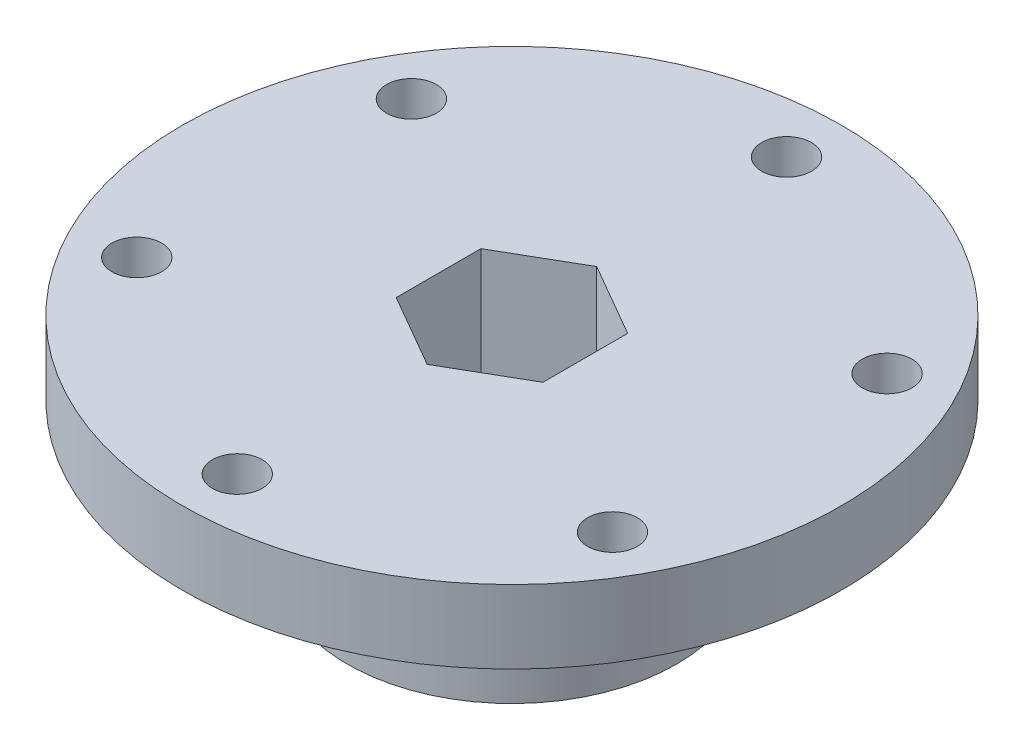
ISO-10303-21;
HEADER;
FILE_DESCRIPTION(('STEP AP214'),'2;1');
FILE_NAME('part.step','',(''),(''),'','','');
FILE_SCHEMA(('AUTOMOTIVE_DESIGN { 1 0 10303 214 1 1 1 1 }'));
ENDSEC;
DATA;
#1=APPLICATION_CONTEXT('core data for automotive mechanical design processes');
#2=APPLICATION_PROTOCOL_DEFINITION('international standard','automotive_design',2000,#1);
#3=PRODUCT_CONTEXT('',#1,'mechanical');
#4=PRODUCT('Part','Part','',(#3));
#5=PRODUCT_RELATED_PRODUCT_CATEGORY('part','',(#4));
#6=PRODUCT_DEFINITION_FORMATION('','',#4);
#7=PRODUCT_DEFINITION_CONTEXT('part definition',#1,'design');
#8=PRODUCT_DEFINITION('design','',#6,#7);
#9=PRODUCT_DEFINITION_SHAPE('','',#8);
#10=(LENGTH_UNIT() NAMED_UNIT(*) SI_UNIT(.MILLI.,.METRE.));
#11=(NAMED_UNIT(*) PLANE_ANGLE_UNIT() SI_UNIT($,.RADIAN.));
#12=(NAMED_UNIT(*) SI_UNIT($,.STERADIAN.) SOLID_ANGLE_UNIT());
#13=UNCERTAINTY_MEASURE_WITH_UNIT(LENGTH_MEASURE(1.E-05),#10,'distance_accuracy_value','');
#14=(GEOMETRIC_REPRESENTATION_CONTEXT(3) GLOBAL_UNCERTAINTY_ASSIGNED_CONTEXT((#13)) GLOBAL_UNIT_ASSIGNED_CONTEXT((#10,
#11,#12)) REPRESENTATION_CONTEXT('',''));
#15=CARTESIAN_POINT('',(0.,0.,0.));
#16=DIRECTION('',(0.,0.,1.));
#17=DIRECTION('',(1.,0.,0.));
#18=AXIS2_PLACEMENT_3D('',#15,#16,#17);
#19=CARTESIAN_POINT('',(20.6222299276169,-19.05,11.90625));
#20=DIRECTION('',(0.,1.,0.));
#21=DIRECTION('',(1.,0.,0.));
#22=AXIS2_PLACEMENT_3D('',#19,#20,#21);
#23=CYLINDRICAL_SURFACE('',#22,2.159);
#24=CARTESIAN_POINT('',(20.6222299276169,0.,11.90625));
#25=DIRECTION('',(0.,-1.,0.));
#26=DIRECTION('',(1.,0.,0.));
#27=AXIS2_PLACEMENT_3D('',#24,#25,#26);
#28=CIRCLE('',#27,2.159);
#29=CARTESIAN_POINT('',(22.7812299276169,0.,11.90625));
#30=VERTEX_POINT('',#29);
#31=EDGE_CURVE('E222',#30,#30,#28,.T.);
#32=ORIENTED_EDGE('',*,*,#31,.F.);
#33=EDGE_LOOP('',(#32));
#34=FACE_BOUND('',#33,.T.);
#35=CARTESIAN_POINT('',(20.6222299276169,-6.35,11.90625));
#36=DIRECTION('',(0.,1.,0.));
#37=DIRECTION('',(1.,0.,0.));
#38=AXIS2_PLACEMENT_3D('',#35,#36,#37);
#39=CIRCLE('',#38,2.159);
#40=CARTESIAN_POINT('',(22.7812299276169,-6.35,11.90625));
#41=VERTEX_POINT('',#40);
#42=EDGE_CURVE('E177',#41,#41,#39,.T.);
#43=ORIENTED_EDGE('',*,*,#42,.F.);
#44=EDGE_LOOP('',(#43));
#45=FACE_BOUND('',#44,.T.);
#46=ADVANCED_FACE('F17',(#34,#45),#23,.F.);
#47=CARTESIAN_POINT('',(0.,-19.05,23.8125));
#48=DIRECTION('',(0.,1.,0.));
#49=DIRECTION('',(1.,0.,0.));
#50=AXIS2_PLACEMENT_3D('',#47,#48,#49);
#51=CYLINDRICAL_SURFACE('',#50,2.159);
#52=CARTESIAN_POINT('',(0.,0.,23.8125));
#53=DIRECTION('',(0.,-1.,0.));
#54=DIRECTION('',(1.,0.,0.));
#55=AXIS2_PLACEMENT_3D('',#52,#53,#54);
#56=CIRCLE('',#55,2.159);
#57=CARTESIAN_POINT('',(2.159,0.,23.8125));
#58=VERTEX_POINT('',#57);
#59=EDGE_CURVE('E219',#58,#58,#56,.T.);
#60=ORIENTED_EDGE('',*,*,#59,.F.);
#61=EDGE_LOOP('',(#60));
#62=FACE_BOUND('',#61,.T.);
#63=CARTESIAN_POINT('',(0.,-6.35,23.8125));
#64=DIRECTION('',(0.,1.,0.));
#65=DIRECTION('',(1.,0.,0.));
#66=AXIS2_PLACEMENT_3D('',#63,#64,#65);
#67=CIRCLE('',#66,2.159);
#68=CARTESIAN_POINT('',(2.159,-6.35,23.8125));
#69=VERTEX_POINT('',#68);
#70=EDGE_CURVE('E174',#69,#69,#67,.T.);
#71=ORIENTED_EDGE('',*,*,#70,.F.);
#72=EDGE_LOOP('',(#71));
#73=FACE_BOUND('',#72,.T.);
#74=ADVANCED_FACE('F347',(#62,#73),#51,.F.);
#75=CARTESIAN_POINT('',(-20.6222299276169,-19.05,-11.90625));
#76=DIRECTION('',(0.,1.,0.));
#77=DIRECTION('',(1.,0.,0.));
#78=AXIS2_PLACEMENT_3D('',#75,#76,#77);
#79=CYLINDRICAL_SURFACE('',#78,2.159);
#80=CARTESIAN_POINT('',(-20.6222299276169,0.,-11.90625));
#81=DIRECTION('',(0.,-1.,0.));
#82=DIRECTION('',(1.,0.,0.));
#83=AXIS2_PLACEMENT_3D('',#80,#81,#82);
#84=CIRCLE('',#83,2.159);
#85=CARTESIAN_POINT('',(-18.4632299276169,0.,-11.90625));
#86=VERTEX_POINT('',#85);
#87=EDGE_CURVE('E216',#86,#86,#84,.T.);
#88=ORIENTED_EDGE('',*,*,#87,.F.);
#89=EDGE_LOOP('',(#88));
#90=FACE_BOUND('',#89,.T.);
#91=CARTESIAN_POINT('',(-20.6222299276169,-6.35,-11.90625));
#92=DIRECTION('',(0.,1.,0.));
#93=DIRECTION('',(1.,0.,0.));
#94=AXIS2_PLACEMENT_3D('',#91,#92,#93);
#95=CIRCLE('',#94,2.159);
#96=CARTESIAN_POINT('',(-18.4632299276169,-6.35,-11.90625));
#97=VERTEX_POINT('',#96);
#98=EDGE_CURVE('E162',#97,#97,#95,.T.);
#99=ORIENTED_EDGE('',*,*,#98,.F.);
#100=EDGE_LOOP('',(#99));
#101=FACE_BOUND('',#100,.T.);
#102=ADVANCED_FACE('F352',(#90,#101),#79,.F.);
#103=CARTESIAN_POINT('',(0.,-19.05,-23.8125));
#104=DIRECTION('',(0.,1.,0.));
#105=DIRECTION('',(1.,0.,0.));
#106=AXIS2_PLACEMENT_3D('',#103,#104,#105);
#107=CYLINDRICAL_SURFACE('',#106,2.159);
#108=CARTESIAN_POINT('',(0.,0.,-23.8125));
#109=DIRECTION('',(0.,-1.,0.));
#110=DIRECTION('',(1.,0.,0.));
#111=AXIS2_PLACEMENT_3D('',#108,#109,#110);
#112=CIRCLE('',#111,2.159);
#113=CARTESIAN_POINT('',(2.159,0.,-23.8125));
#114=VERTEX_POINT('',#113);
#115=EDGE_CURVE('E181',#114,#114,#112,.T.);
#116=ORIENTED_EDGE('',*,*,#115,.F.);
#117=EDGE_LOOP('',(#116));
#118=FACE_BOUND('',#117,.T.);
#119=CARTESIAN_POINT('',(0.,-6.35,-23.8125));
#120=DIRECTION('',(0.,1.,0.));
#121=DIRECTION('',(1.,0.,0.));
#122=AXIS2_PLACEMENT_3D('',#119,#120,#121);
#123=CIRCLE('',#122,2.159);
#124=CARTESIAN_POINT('',(2.159,-6.35,-23.8125));
#125=VERTEX_POINT('',#124);
#126=EDGE_CURVE('E156',#125,#125,#123,.T.);
#127=ORIENTED_EDGE('',*,*,#126,.F.);
#128=EDGE_LOOP('',(#127));
#129=FACE_BOUND('',#128,.T.);
#130=ADVANCED_FACE('F387',(#118,#129),#107,.F.);
#131=CARTESIAN_POINT('',(-20.6222299276169,-19.05,11.90625));
#132=DIRECTION('',(0.,1.,0.));
#133=DIRECTION('',(1.,0.,0.));
#134=AXIS2_PLACEMENT_3D('',#131,#132,#133);
#135=CYLINDRICAL_SURFACE('',#134,2.159);
#136=CARTESIAN_POINT('',(-20.6222299276169,0.,11.90625));
#137=DIRECTION('',(0.,-1.,0.));
#138=DIRECTION('',(1.,0.,0.));
#139=AXIS2_PLACEMENT_3D('',#136,#137,#138);
#140=CIRCLE('',#139,2.159);
#141=CARTESIAN_POINT('',(-18.4632299276169,0.,11.90625));
#142=VERTEX_POINT('',#141);
#143=EDGE_CURVE('E178',#142,#142,#140,.T.);
#144=ORIENTED_EDGE('',*,*,#143,.F.);
#145=EDGE_LOOP('',(#144));
#146=FACE_BOUND('',#145,.T.);
#147=CARTESIAN_POINT('',(-20.6222299276169,-6.35,11.90625));
#148=DIRECTION('',(0.,1.,0.));
#149=DIRECTION('',(1.,0.,0.));
#150=AXIS2_PLACEMENT_3D('',#147,#148,#149);
#151=CIRCLE('',#150,2.159);
#152=CARTESIAN_POINT('',(-18.4632299276169,-6.35,11.90625));
#153=VERTEX_POINT('',#152);
#154=EDGE_CURVE('E151',#153,#153,#151,.T.);
#155=ORIENTED_EDGE('',*,*,#154,.F.);
#156=EDGE_LOOP('',(#155));
#157=FACE_BOUND('',#156,.T.);
#158=ADVANCED_FACE('F364',(#146,#157),#135,.F.);
#159=CARTESIAN_POINT('',(20.6222299276169,-19.05,-11.90625));
#160=DIRECTION('',(0.,1.,0.));
#161=DIRECTION('',(1.,0.,0.));
#162=AXIS2_PLACEMENT_3D('',#159,#160,#161);
#163=CYLINDRICAL_SURFACE('',#162,2.159);
#164=CARTESIAN_POINT('',(20.6222299276169,0.,-11.90625));
#165=DIRECTION('',(0.,-1.,0.));
#166=DIRECTION('',(1.,0.,0.));
#167=AXIS2_PLACEMENT_3D('',#164,#165,#166);
#168=CIRCLE('',#167,2.159);
#169=CARTESIAN_POINT('',(22.7812299276169,0.,-11.90625));
#170=VERTEX_POINT('',#169);
#171=EDGE_CURVE('E182',#170,#170,#168,.T.);
#172=ORIENTED_EDGE('',*,*,#171,.F.);
#173=EDGE_LOOP('',(#172));
#174=FACE_BOUND('',#173,.T.);
#175=CARTESIAN_POINT('',(20.6222299276169,-6.35,-11.90625));
#176=DIRECTION('',(0.,1.,0.));
#177=DIRECTION('',(1.,0.,0.));
#178=AXIS2_PLACEMENT_3D('',#175,#176,#177);
#179=CIRCLE('',#178,2.159);
#180=CARTESIAN_POINT('',(22.7812299276169,-6.35,-11.90625));
#181=VERTEX_POINT('',#180);
#182=EDGE_CURVE('E157',#181,#181,#179,.T.);
#183=ORIENTED_EDGE('',*,*,#182,.F.);
#184=EDGE_LOOP('',(#183));
#185=FACE_BOUND('',#184,.T.);
#186=ADVANCED_FACE('F359',(#174,#185),#163,.F.);
#187=CARTESIAN_POINT('',(-6.3627,-19.05,3.67350655777282));
#188=DIRECTION('',(-0.5,0.,0.866025403784439));
#189=DIRECTION('',(0.,1.,0.));
#190=AXIS2_PLACEMENT_3D('',#187,#188,#189);
#191=PLANE('',#190);
#192=DIRECTION('',(-0.866025403784439,0.,-0.5));
#193=VECTOR('',#192,1.);
#194=CARTESIAN_POINT('',(-4.772025,0.,4.59188319721603));
#195=LINE('',#194,#193);
#196=CARTESIAN_POINT('',(0.,0.,7.34701311554565));
#197=VERTEX_POINT('',#196);
#198=CARTESIAN_POINT('',(-6.3627,0.,3.67350655777282));
#199=VERTEX_POINT('',#198);
#200=EDGE_CURVE('E193',#197,#199,#195,.T.);
#201=ORIENTED_EDGE('',*,*,#200,.F.);
#202=DIRECTION('',(0.,1.,0.));
#203=VECTOR('',#202,1.);
#204=CARTESIAN_POINT('',(0.,-19.05,7.34701311554565));
#205=LINE('',#204,#203);
#206=CARTESIAN_POINT('',(0.,-19.05,7.34701311554565));
#207=VERTEX_POINT('',#206);
#208=EDGE_CURVE('E256',#207,#197,#205,.T.);
#209=ORIENTED_EDGE('',*,*,#208,.F.);
#210=DIRECTION('',(0.866025403784439,0.,0.5));
#211=VECTOR('',#210,1.);
#212=CARTESIAN_POINT('',(-4.772025,-19.05,4.59188319721603));
#213=LINE('',#212,#211);
#214=CARTESIAN_POINT('',(-6.3627,-19.05,3.67350655777282));
#215=VERTEX_POINT('',#214);
#216=EDGE_CURVE('E240',#215,#207,#213,.T.);
#217=ORIENTED_EDGE('',*,*,#216,.F.);
#218=DIRECTION('',(0.,1.,0.));
#219=VECTOR('',#218,1.);
#220=CARTESIAN_POINT('',(-6.3627,-19.05,3.67350655777282));
#221=LINE('',#220,#219);
#222=EDGE_CURVE('E11',#215,#199,#221,.T.);
#223=ORIENTED_EDGE('',*,*,#222,.T.);
#224=EDGE_LOOP('',(#201,#209,#217,#223));
#225=FACE_BOUND('',#224,.T.);
#226=ADVANCED_FACE('F282',(#225),#191,.F.);
#227=CARTESIAN_POINT('',(-6.3627,-19.05,-3.67350655777282));
#228=DIRECTION('',(-1.,0.,0.));
#229=DIRECTION('',(0.,0.,1.));
#230=AXIS2_PLACEMENT_3D('',#227,#228,#229);
#231=PLANE('',#230);
#232=DIRECTION('',(0.,0.,-1.));
#233=VECTOR('',#232,1.);
#234=CARTESIAN_POINT('',(-6.3627,0.,-1.83675327888642));
#235=LINE('',#234,#233);
#236=CARTESIAN_POINT('',(-6.3627,0.,-3.67350655777282));
#237=VERTEX_POINT('',#236);
#238=EDGE_CURVE('E198',#199,#237,#235,.T.);
#239=ORIENTED_EDGE('',*,*,#238,.F.);
#240=ORIENTED_EDGE('',*,*,#222,.F.);
#241=DIRECTION('',(0.,0.,1.));
#242=VECTOR('',#241,1.);
#243=CARTESIAN_POINT('',(-6.3627,-19.05,-1.83675327888642));
#244=LINE('',#243,#242);
#245=CARTESIAN_POINT('',(-6.3627,-19.05,-3.67350655777282));
#246=VERTEX_POINT('',#245);
#247=EDGE_CURVE('E236',#246,#215,#244,.T.);
#248=ORIENTED_EDGE('',*,*,#247,.F.);
#249=DIRECTION('',(0.,1.,0.));
#250=VECTOR('',#249,1.);
#251=CARTESIAN_POINT('',(-6.3627,-19.05,-3.67350655777282));
#252=LINE('',#251,#250);
#253=EDGE_CURVE('E20',#246,#237,#252,.T.);
#254=ORIENTED_EDGE('',*,*,#253,.T.);
#255=EDGE_LOOP('',(#239,#240,#248,#254));
#256=FACE_BOUND('',#255,.T.);
#257=ADVANCED_FACE('F284',(#256),#231,.F.);
#258=CARTESIAN_POINT('',(0.,-19.05,-7.34701311554568));
#259=DIRECTION('',(-0.5,0.,-0.866025403784439));
#260=DIRECTION('',(-0.866025403784439,0.,0.5));
#261=AXIS2_PLACEMENT_3D('',#258,#259,#260);
#262=PLANE('',#261);
#263=DIRECTION('',(0.866025403784439,0.,-0.5));
#264=VECTOR('',#263,1.);
#265=CARTESIAN_POINT('',(-1.590675,0.,-6.42863647610245));
#266=LINE('',#265,#264);
#267=CARTESIAN_POINT('',(0.,0.,-7.34701311554568));
#268=VERTEX_POINT('',#267);
#269=EDGE_CURVE('E202',#237,#268,#266,.T.);
#270=ORIENTED_EDGE('',*,*,#269,.F.);
#271=ORIENTED_EDGE('',*,*,#253,.F.);
#272=DIRECTION('',(-0.866025403784439,0.,0.5));
#273=VECTOR('',#272,1.);
#274=CARTESIAN_POINT('',(-1.590675,-19.05,-6.42863647610245));
#275=LINE('',#274,#273);
#276=CARTESIAN_POINT('',(0.,-19.05,-7.34701311554568));
#277=VERTEX_POINT('',#276);
#278=EDGE_CURVE('E232',#277,#246,#275,.T.);
#279=ORIENTED_EDGE('',*,*,#278,.F.);
#280=DIRECTION('',(0.,1.,0.));
#281=VECTOR('',#280,1.);
#282=CARTESIAN_POINT('',(0.,-19.05,-7.34701311554568));
#283=LINE('',#282,#281);
#284=EDGE_CURVE('E169',#277,#268,#283,.T.);
#285=ORIENTED_EDGE('',*,*,#284,.T.);
#286=EDGE_LOOP('',(#270,#271,#279,#285));
#287=FACE_BOUND('',#286,.T.);
#288=ADVANCED_FACE('F273',(#287),#262,.F.);
#289=CARTESIAN_POINT('',(6.3627,-19.05,-3.67350655777282));
#290=DIRECTION('',(0.5,0.,-0.866025403784439));
#291=DIRECTION('',(0.,-1.,0.));
#292=AXIS2_PLACEMENT_3D('',#289,#290,#291);
#293=PLANE('',#292);
#294=DIRECTION('',(0.866025403784439,0.,0.5));
#295=VECTOR('',#294,1.);
#296=CARTESIAN_POINT('',(4.772025,0.,-4.59188319721605));
#297=LINE('',#296,#295);
#298=CARTESIAN_POINT('',(6.3627,0.,-3.67350655777282));
#299=VERTEX_POINT('',#298);
#300=EDGE_CURVE('E188',#268,#299,#297,.T.);
#301=ORIENTED_EDGE('',*,*,#300,.F.);
#302=ORIENTED_EDGE('',*,*,#284,.F.);
#303=DIRECTION('',(-0.866025403784439,0.,-0.5));
#304=VECTOR('',#303,1.);
#305=CARTESIAN_POINT('',(4.772025,-19.05,-4.59188319721603));
#306=LINE('',#305,#304);
#307=CARTESIAN_POINT('',(6.3627,-19.05,-3.67350655777282));
#308=VERTEX_POINT('',#307);
#309=EDGE_CURVE('E228',#308,#277,#306,.T.);
#310=ORIENTED_EDGE('',*,*,#309,.F.);
#311=DIRECTION('',(0.,1.,0.));
#312=VECTOR('',#311,1.);
#313=CARTESIAN_POINT('',(6.3627,-19.05,-3.67350655777282));
#314=LINE('',#313,#312);
#315=EDGE_CURVE('E170',#308,#299,#314,.T.);
#316=ORIENTED_EDGE('',*,*,#315,.T.);
#317=EDGE_LOOP('',(#301,#302,#310,#316));
#318=FACE_BOUND('',#317,.T.);
#319=ADVANCED_FACE('F265',(#318),#293,.F.);
#320=CARTESIAN_POINT('',(6.3627,-19.05,3.67350655777282));
#321=DIRECTION('',(1.,0.,0.));
#322=DIRECTION('',(0.,0.,1.));
#323=AXIS2_PLACEMENT_3D('',#320,#321,#322);
#324=PLANE('',#323);
#325=DIRECTION('',(0.,0.,1.));
#326=VECTOR('',#325,1.);
#327=CARTESIAN_POINT('',(6.3627,0.,1.83675327888642));
#328=LINE('',#327,#326);
#329=CARTESIAN_POINT('',(6.3627,0.,3.67350655777282));
#330=VERTEX_POINT('',#329);
#331=EDGE_CURVE('E194',#299,#330,#328,.T.);
#332=ORIENTED_EDGE('',*,*,#331,.F.);
#333=ORIENTED_EDGE('',*,*,#315,.F.);
#334=DIRECTION('',(0.,0.,-1.));
#335=VECTOR('',#334,1.);
#336=CARTESIAN_POINT('',(6.3627,-19.05,1.83675327888642));
#337=LINE('',#336,#335);
#338=CARTESIAN_POINT('',(6.3627,-19.05,3.67350655777282));
#339=VERTEX_POINT('',#338);
#340=EDGE_CURVE('E248',#339,#308,#337,.T.);
#341=ORIENTED_EDGE('',*,*,#340,.F.);
#342=DIRECTION('',(0.,1.,0.));
#343=VECTOR('',#342,1.);
#344=CARTESIAN_POINT('',(6.3627,-19.05,3.67350655777282));
#345=LINE('',#344,#343);
#346=EDGE_CURVE('E45',#339,#330,#345,.T.);
#347=ORIENTED_EDGE('',*,*,#346,.T.);
#348=EDGE_LOOP('',(#332,#333,#341,#347));
#349=FACE_BOUND('',#348,.T.);
#350=ADVANCED_FACE('F267',(#349),#324,.F.);
#351=CARTESIAN_POINT('',(0.,-19.05,7.34701311554565));
#352=DIRECTION('',(0.5,0.,0.866025403784439));
#353=DIRECTION('',(0.,-1.,0.));
#354=AXIS2_PLACEMENT_3D('',#351,#352,#353);
#355=PLANE('',#354);
#356=DIRECTION('',(-0.866025403784439,0.,0.5));
#357=VECTOR('',#356,1.);
#358=CARTESIAN_POINT('',(1.590675,0.,6.42863647610245));
#359=LINE('',#358,#357);
#360=EDGE_CURVE('E189',#330,#197,#359,.T.);
#361=ORIENTED_EDGE('',*,*,#360,.F.);
#362=ORIENTED_EDGE('',*,*,#346,.F.);
#363=DIRECTION('',(0.866025403784439,0.,-0.5));
#364=VECTOR('',#363,1.);
#365=CARTESIAN_POINT('',(1.590675,-19.05,6.42863647610245));
#366=LINE('',#365,#364);
#367=EDGE_CURVE('E244',#207,#339,#366,.T.);
#368=ORIENTED_EDGE('',*,*,#367,.F.);
#369=ORIENTED_EDGE('',*,*,#208,.T.);
#370=EDGE_LOOP('',(#361,#362,#368,#369));
#371=FACE_BOUND('',#370,.T.);
#372=ADVANCED_FACE('F279',(#371),#355,.F.);
#373=CARTESIAN_POINT('',(0.,-6.35,0.));
#374=DIRECTION('',(0.,-1.,0.));
#375=DIRECTION('',(1.,0.,0.));
#376=AXIS2_PLACEMENT_3D('',#373,#374,#375);
#377=CYLINDRICAL_SURFACE('',#376,14.2748);
#378=CARTESIAN_POINT('',(0.,-19.05,0.));
#379=DIRECTION('',(0.,-1.,0.));
#380=DIRECTION('',(1.,0.,0.));
#381=AXIS2_PLACEMENT_3D('',#378,#379,#380);
#382=CIRCLE('',#381,14.2748);
#383=CARTESIAN_POINT('',(14.2748,-19.05,0.));
#384=VERTEX_POINT('',#383);
#385=EDGE_CURVE('E36',#384,#384,#382,.T.);
#386=ORIENTED_EDGE('',*,*,#385,.F.);
#387=EDGE_LOOP('',(#386));
#388=FACE_BOUND('',#387,.T.);
#389=CARTESIAN_POINT('',(0.,-6.35,0.));
#390=DIRECTION('',(0.,1.,0.));
#391=DIRECTION('',(1.,0.,0.));
#392=AXIS2_PLACEMENT_3D('',#389,#390,#391);
#393=CIRCLE('',#392,14.2748);
#394=CARTESIAN_POINT('',(14.2748,-6.35,0.));
#395=VERTEX_POINT('',#394);
#396=EDGE_CURVE('E165',#395,#395,#393,.T.);
#397=ORIENTED_EDGE('',*,*,#396,.F.);
#398=EDGE_LOOP('',(#397));
#399=FACE_BOUND('',#398,.T.);
#400=ADVANCED_FACE('F308',(#388,#399),#377,.T.);
#401=CARTESIAN_POINT('',(0.,-19.05,0.));
#402=DIRECTION('',(0.,-1.,0.));
#403=DIRECTION('',(0.,0.,-1.));
#404=AXIS2_PLACEMENT_3D('',#401,#402,#403);
#405=PLANE('',#404);
#406=ORIENTED_EDGE('',*,*,#385,.T.);
#407=EDGE_LOOP('',(#406));
#408=FACE_BOUND('',#407,.T.);
#409=ORIENTED_EDGE('',*,*,#309,.T.);
#410=ORIENTED_EDGE('',*,*,#278,.T.);
#411=ORIENTED_EDGE('',*,*,#247,.T.);
#412=ORIENTED_EDGE('',*,*,#216,.T.);
#413=ORIENTED_EDGE('',*,*,#367,.T.);
#414=ORIENTED_EDGE('',*,*,#340,.T.);
#415=EDGE_LOOP('',(#409,#410,#411,#412,#413,#414));
#416=FACE_BOUND('',#415,.T.);
#417=ADVANCED_FACE('F277',(#408,#416),#405,.T.);
#418=CARTESIAN_POINT('',(0.,0.,0.));
#419=DIRECTION('',(0.,-1.,0.));
#420=DIRECTION('',(-1.,0.,0.));
#421=AXIS2_PLACEMENT_3D('',#418,#419,#420);
#422=CYLINDRICAL_SURFACE('',#421,28.575);
#423=CARTESIAN_POINT('',(0.,-6.35,0.));
#424=DIRECTION('',(0.,-1.,0.));
#425=DIRECTION('',(-1.,0.,0.));
#426=AXIS2_PLACEMENT_3D('',#423,#424,#425);
#427=CIRCLE('',#426,28.575);
#428=CARTESIAN_POINT('',(-28.575,-6.35,0.));
#429=VERTEX_POINT('',#428);
#430=EDGE_CURVE('E185',#429,#429,#427,.T.);
#431=ORIENTED_EDGE('',*,*,#430,.F.);
#432=EDGE_LOOP('',(#431));
#433=FACE_BOUND('',#432,.T.);
#434=CARTESIAN_POINT('',(0.,0.,0.));
#435=DIRECTION('',(0.,1.,0.));
#436=DIRECTION('',(-1.,0.,0.));
#437=AXIS2_PLACEMENT_3D('',#434,#435,#436);
#438=CIRCLE('',#437,28.575);
#439=CARTESIAN_POINT('',(-28.575,0.,0.));
#440=VERTEX_POINT('',#439);
#441=EDGE_CURVE('E225',#440,#440,#438,.T.);
#442=ORIENTED_EDGE('',*,*,#441,.F.);
#443=EDGE_LOOP('',(#442));
#444=FACE_BOUND('',#443,.T.);
#445=ADVANCED_FACE('F302',(#433,#444),#422,.T.);
#446=CARTESIAN_POINT('',(0.,0.,0.));
#447=DIRECTION('',(0.,-1.,0.));
#448=DIRECTION('',(0.,0.,-1.));
#449=AXIS2_PLACEMENT_3D('',#446,#447,#448);
#450=PLANE('',#449);
#451=ORIENTED_EDGE('',*,*,#441,.T.);
#452=EDGE_LOOP('',(#451));
#453=FACE_BOUND('',#452,.T.);
#454=ORIENTED_EDGE('',*,*,#31,.T.);
#455=EDGE_LOOP('',(#454));
#456=FACE_BOUND('',#455,.T.);
#457=ORIENTED_EDGE('',*,*,#59,.T.);
#458=EDGE_LOOP('',(#457));
#459=FACE_BOUND('',#458,.T.);
#460=ORIENTED_EDGE('',*,*,#87,.T.);
#461=EDGE_LOOP('',(#460));
#462=FACE_BOUND('',#461,.T.);
#463=ORIENTED_EDGE('',*,*,#115,.T.);
#464=EDGE_LOOP('',(#463));
#465=FACE_BOUND('',#464,.T.);
#466=ORIENTED_EDGE('',*,*,#143,.T.);
#467=EDGE_LOOP('',(#466));
#468=FACE_BOUND('',#467,.T.);
#469=ORIENTED_EDGE('',*,*,#171,.T.);
#470=EDGE_LOOP('',(#469));
#471=FACE_BOUND('',#470,.T.);
#472=ORIENTED_EDGE('',*,*,#300,.T.);
#473=ORIENTED_EDGE('',*,*,#331,.T.);
#474=ORIENTED_EDGE('',*,*,#360,.T.);
#475=ORIENTED_EDGE('',*,*,#200,.T.);
#476=ORIENTED_EDGE('',*,*,#238,.T.);
#477=ORIENTED_EDGE('',*,*,#269,.T.);
#478=EDGE_LOOP('',(#472,#473,#474,#475,#476,#477));
#479=FACE_BOUND('',#478,.T.);
#480=ADVANCED_FACE('F269',(#453,#456,#459,#462,#465,#468,#471,#479),#450,.F.);
#481=CARTESIAN_POINT('',(0.,-6.35,0.));
#482=DIRECTION('',(0.,-1.,0.));
#483=DIRECTION('',(0.,0.,-1.));
#484=AXIS2_PLACEMENT_3D('',#481,#482,#483);
#485=PLANE('',#484);
#486=ORIENTED_EDGE('',*,*,#430,.T.);
#487=EDGE_LOOP('',(#486));
#488=FACE_BOUND('',#487,.T.);
#489=ORIENTED_EDGE('',*,*,#42,.T.);
#490=EDGE_LOOP('',(#489));
#491=FACE_BOUND('',#490,.T.);
#492=ORIENTED_EDGE('',*,*,#70,.T.);
#493=EDGE_LOOP('',(#492));
#494=FACE_BOUND('',#493,.T.);
#495=ORIENTED_EDGE('',*,*,#98,.T.);
#496=EDGE_LOOP('',(#495));
#497=FACE_BOUND('',#496,.T.);
#498=ORIENTED_EDGE('',*,*,#126,.T.);
#499=EDGE_LOOP('',(#498));
#500=FACE_BOUND('',#499,.T.);
#501=ORIENTED_EDGE('',*,*,#154,.T.);
#502=EDGE_LOOP('',(#501));
#503=FACE_BOUND('',#502,.T.);
#504=ORIENTED_EDGE('',*,*,#182,.T.);
#505=EDGE_LOOP('',(#504));
#506=FACE_BOUND('',#505,.T.);
#507=ORIENTED_EDGE('',*,*,#396,.T.);
#508=EDGE_LOOP('',(#507));
#509=FACE_BOUND('',#508,.T.);
#510=ADVANCED_FACE('F152',(#488,#491,#494,#497,#500,#503,#506,#509),#485,.T.);
#511=CLOSED_SHELL('',(#46,#74,#102,#130,#158,#186,#226,#257,#288,#319,#350,#372,#400,#417,#445,
#480,#510));
#512=MANIFOLD_SOLID_BREP('B1',#511);
#513=ADVANCED_BREP_SHAPE_REPRESENTATION('',(#18,#512),#14);
#514=SHAPE_DEFINITION_REPRESENTATION(#9,#513);
ENDSEC;
END-ISO-10303-21;
